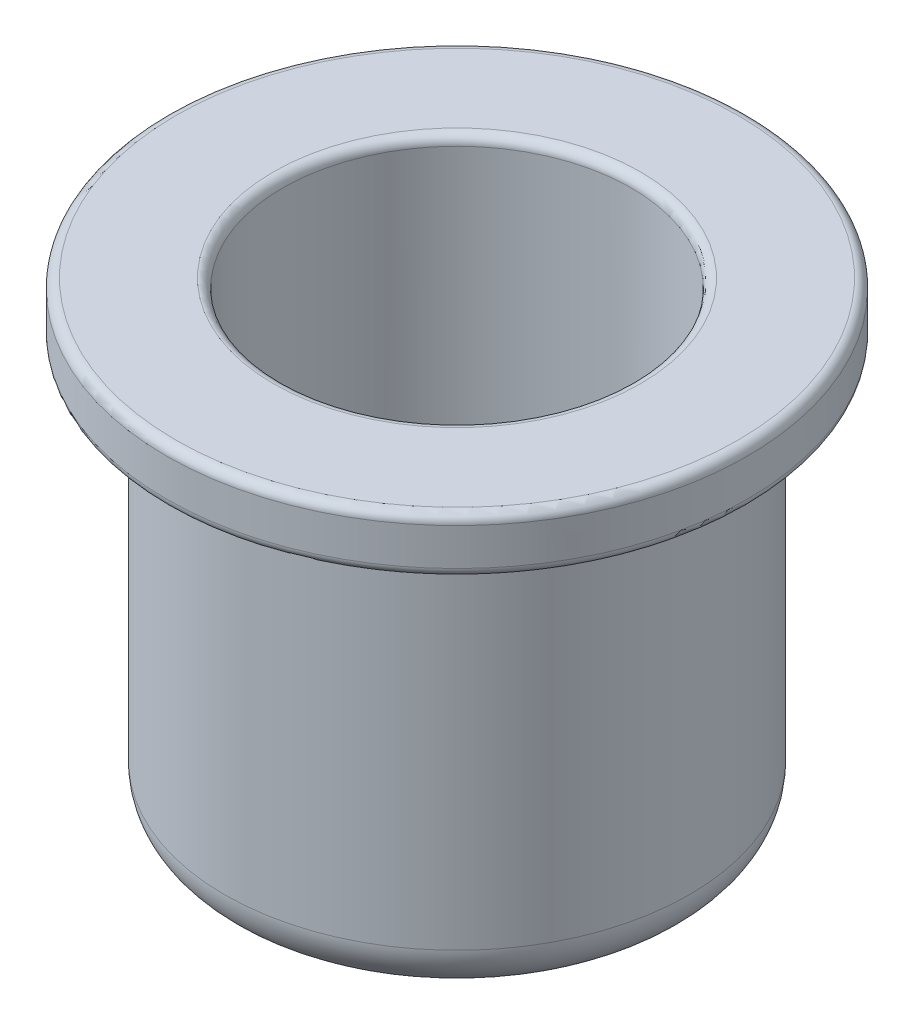
ISO-10303-21;
HEADER;
FILE_DESCRIPTION(('STEP AP214'),'2;1');
FILE_NAME('part.step','',(''),(''),'','','');
FILE_SCHEMA(('AUTOMOTIVE_DESIGN { 1 0 10303 214 1 1 1 1 }'));
ENDSEC;
DATA;
#1=APPLICATION_CONTEXT('core data for automotive mechanical design processes');
#2=APPLICATION_PROTOCOL_DEFINITION('international standard','automotive_design',2000,#1);
#3=PRODUCT_CONTEXT('',#1,'mechanical');
#4=PRODUCT('Part','Part','',(#3));
#5=PRODUCT_RELATED_PRODUCT_CATEGORY('part','',(#4));
#6=PRODUCT_DEFINITION_FORMATION('','',#4);
#7=PRODUCT_DEFINITION_CONTEXT('part definition',#1,'design');
#8=PRODUCT_DEFINITION('design','',#6,#7);
#9=PRODUCT_DEFINITION_SHAPE('','',#8);
#10=(LENGTH_UNIT() NAMED_UNIT(*) SI_UNIT(.MILLI.,.METRE.));
#11=(NAMED_UNIT(*) PLANE_ANGLE_UNIT() SI_UNIT($,.RADIAN.));
#12=(NAMED_UNIT(*) SI_UNIT($,.STERADIAN.) SOLID_ANGLE_UNIT());
#13=UNCERTAINTY_MEASURE_WITH_UNIT(LENGTH_MEASURE(1.E-05),#10,'distance_accuracy_value','');
#14=(GEOMETRIC_REPRESENTATION_CONTEXT(3) GLOBAL_UNCERTAINTY_ASSIGNED_CONTEXT((#13)) GLOBAL_UNIT_ASSIGNED_CONTEXT((#10,
#11,#12)) REPRESENTATION_CONTEXT('',''));
#15=CARTESIAN_POINT('',(0.,0.,0.));
#16=DIRECTION('',(0.,0.,1.));
#17=DIRECTION('',(1.,0.,0.));
#18=AXIS2_PLACEMENT_3D('',#15,#16,#17);
#19=CARTESIAN_POINT('',(0.,12.7,0.));
#20=DIRECTION('',(0.,1.,0.));
#21=DIRECTION('',(0.,0.,1.));
#22=AXIS2_PLACEMENT_3D('',#19,#20,#21);
#23=PLANE('',#22);
#24=CARTESIAN_POINT('',(0.,12.7,0.));
#25=DIRECTION('',(0.,1.,0.));
#26=DIRECTION('',(-1.,0.,5.66735536331981E-13));
#27=AXIS2_PLACEMENT_3D('',#24,#25,#26);
#28=CIRCLE('',#27,5.0165);
#29=CARTESIAN_POINT('',(-5.0165,12.7,1.14105258488892E-12));
#30=VERTEX_POINT('',#29);
#31=CARTESIAN_POINT('',(5.0165,12.7,-5.77948063548833E-13));
#32=VERTEX_POINT('',#31);
#33=EDGE_CURVE('E67',#30,#32,#28,.T.);
#34=ORIENTED_EDGE('',*,*,#33,.F.);
#35=CARTESIAN_POINT('',(0.,12.7,0.));
#36=DIRECTION('',(0.,1.,0.));
#37=DIRECTION('',(1.,0.,0.));
#38=AXIS2_PLACEMENT_3D('',#35,#36,#37);
#39=CIRCLE('',#38,5.0165);
#40=EDGE_CURVE('E62',#32,#30,#39,.T.);
#41=ORIENTED_EDGE('',*,*,#40,.F.);
#42=EDGE_LOOP('',(#34,#41));
#43=FACE_BOUND('',#42,.T.);
#44=CARTESIAN_POINT('',(0.,12.7,0.));
#45=DIRECTION('',(0.,-1.,0.));
#46=DIRECTION('',(1.,0.,0.));
#47=AXIS2_PLACEMENT_3D('',#44,#45,#46);
#48=CIRCLE('',#47,7.6835);
#49=CARTESIAN_POINT('',(7.6835,12.7,0.));
#50=VERTEX_POINT('',#49);
#51=CARTESIAN_POINT('',(-7.6835,12.7,0.));
#52=VERTEX_POINT('',#51);
#53=EDGE_CURVE('E105',#50,#52,#48,.T.);
#54=ORIENTED_EDGE('',*,*,#53,.F.);
#55=CARTESIAN_POINT('',(0.,12.7,0.));
#56=DIRECTION('',(0.,-1.,0.));
#57=DIRECTION('',(-1.,0.,0.));
#58=AXIS2_PLACEMENT_3D('',#55,#56,#57);
#59=CIRCLE('',#58,7.6835);
#60=EDGE_CURVE('E73',#52,#50,#59,.T.);
#61=ORIENTED_EDGE('',*,*,#60,.F.);
#62=EDGE_LOOP('',(#54,#61));
#63=FACE_BOUND('',#62,.T.);
#64=ADVANCED_FACE('F16',(#43,#63),#23,.T.);
#65=CARTESIAN_POINT('',(0.,12.446,0.));
#66=DIRECTION('',(0.,1.,0.));
#67=DIRECTION('',(0.999930025461511,0.,-0.0118298005283784));
#68=AXIS2_PLACEMENT_3D('',#65,#66,#67);
#69=TOROIDAL_SURFACE('',#68,5.0165,0.254);
#70=CARTESIAN_POINT('',(0.,12.446,0.));
#71=DIRECTION('',(0.,1.,0.));
#72=DIRECTION('',(0.,0.,1.));
#73=AXIS2_PLACEMENT_3D('',#70,#71,#72);
#74=CIRCLE('',#73,4.7625);
#75=CARTESIAN_POINT('',(0.,12.446,4.7625));
#76=VERTEX_POINT('',#75);
#77=EDGE_CURVE('E101',#76,#76,#74,.F.);
#78=ORIENTED_EDGE('',*,*,#77,.T.);
#79=EDGE_LOOP('',(#78));
#80=FACE_BOUND('',#79,.T.);
#81=ORIENTED_EDGE('',*,*,#33,.T.);
#82=ORIENTED_EDGE('',*,*,#40,.T.);
#83=EDGE_LOOP('',(#81,#82));
#84=FACE_BOUND('',#83,.T.);
#85=ADVANCED_FACE('F72',(#80,#84),#69,.T.);
#86=CARTESIAN_POINT('',(0.,12.446,0.));
#87=DIRECTION('',(0.,1.,0.));
#88=DIRECTION('',(-0.999987516677049,0.,-0.00499664788318093));
#89=AXIS2_PLACEMENT_3D('',#86,#87,#88);
#90=TOROIDAL_SURFACE('',#89,7.6835,0.254);
#91=CARTESIAN_POINT('',(0.,12.446,0.));
#92=DIRECTION('',(0.,1.,0.));
#93=DIRECTION('',(0.,0.,1.));
#94=AXIS2_PLACEMENT_3D('',#91,#92,#93);
#95=CIRCLE('',#94,7.9375);
#96=CARTESIAN_POINT('',(0.,12.446,7.9375));
#97=VERTEX_POINT('',#96);
#98=EDGE_CURVE('E139',#97,#97,#95,.F.);
#99=ORIENTED_EDGE('',*,*,#98,.F.);
#100=EDGE_LOOP('',(#99));
#101=FACE_BOUND('',#100,.T.);
#102=ORIENTED_EDGE('',*,*,#53,.T.);
#103=ORIENTED_EDGE('',*,*,#60,.T.);
#104=EDGE_LOOP('',(#102,#103));
#105=FACE_BOUND('',#104,.T.);
#106=ADVANCED_FACE('F92',(#101,#105),#90,.T.);
#107=CARTESIAN_POINT('',(0.,0.,0.));
#108=DIRECTION('',(0.,1.,0.));
#109=DIRECTION('',(0.,0.,1.));
#110=AXIS2_PLACEMENT_3D('',#107,#108,#109);
#111=CYLINDRICAL_SURFACE('',#110,4.7625);
#112=CARTESIAN_POINT('',(0.,0.254,0.));
#113=DIRECTION('',(0.,1.,0.));
#114=DIRECTION('',(-0.999965324231172,0.,-0.00832768486716382));
#115=AXIS2_PLACEMENT_3D('',#112,#113,#114);
#116=CIRCLE('',#115,4.7625);
#117=CARTESIAN_POINT('',(-4.76233485665096,0.254,-0.0396605991798677));
#118=VERTEX_POINT('',#117);
#119=EDGE_CURVE('E142',#118,#118,#116,.T.);
#120=ORIENTED_EDGE('',*,*,#119,.F.);
#121=EDGE_LOOP('',(#120));
#122=FACE_BOUND('',#121,.T.);
#123=ORIENTED_EDGE('',*,*,#77,.F.);
#124=EDGE_LOOP('',(#123));
#125=FACE_BOUND('',#124,.T.);
#126=ADVANCED_FACE('F309',(#122,#125),#111,.F.);
#127=CARTESIAN_POINT('',(0.,12.7,0.));
#128=DIRECTION('',(0.,1.,0.));
#129=DIRECTION('',(0.,0.,1.));
#130=AXIS2_PLACEMENT_3D('',#127,#128,#129);
#131=CYLINDRICAL_SURFACE('',#130,7.9375);
#132=ORIENTED_EDGE('',*,*,#98,.T.);
#133=EDGE_LOOP('',(#132));
#134=FACE_BOUND('',#133,.T.);
#135=CARTESIAN_POINT('',(0.,11.43,0.));
#136=DIRECTION('',(0.,1.,0.));
#137=DIRECTION('',(0.999974808978118,0.,-0.0070979862761847));
#138=AXIS2_PLACEMENT_3D('',#135,#136,#137);
#139=CIRCLE('',#138,7.9375);
#140=CARTESIAN_POINT('',(7.93730004626381,11.43,-0.0563402660672161));
#141=VERTEX_POINT('',#140);
#142=EDGE_CURVE('E146',#141,#141,#139,.F.);
#143=ORIENTED_EDGE('',*,*,#142,.F.);
#144=EDGE_LOOP('',(#143));
#145=FACE_BOUND('',#144,.T.);
#146=ADVANCED_FACE('F271',(#134,#145),#131,.T.);
#147=CARTESIAN_POINT('',(0.,0.254,0.));
#148=DIRECTION('',(0.,1.,0.));
#149=DIRECTION('',(-0.999965324231172,0.,-0.00832768486716382));
#150=AXIS2_PLACEMENT_3D('',#147,#148,#149);
#151=TOROIDAL_SURFACE('',#150,5.0165,0.254);
#152=ORIENTED_EDGE('',*,*,#119,.T.);
#153=EDGE_LOOP('',(#152));
#154=FACE_BOUND('',#153,.T.);
#155=CARTESIAN_POINT('',(0.,0.,0.));
#156=DIRECTION('',(0.,-1.,0.));
#157=DIRECTION('',(1.,0.,0.));
#158=AXIS2_PLACEMENT_3D('',#155,#156,#157);
#159=CIRCLE('',#158,5.01649999999999);
#160=CARTESIAN_POINT('',(5.01649999999999,0.,1.7815155374234E-13));
#161=VERTEX_POINT('',#160);
#162=CARTESIAN_POINT('',(-5.01649999999999,0.,0.));
#163=VERTEX_POINT('',#162);
#164=EDGE_CURVE('E235',#161,#163,#159,.T.);
#165=ORIENTED_EDGE('',*,*,#164,.T.);
#166=CARTESIAN_POINT('',(0.,0.,0.));
#167=DIRECTION('',(0.,-1.,0.));
#168=DIRECTION('',(-1.,0.,0.));
#169=AXIS2_PLACEMENT_3D('',#166,#167,#168);
#170=CIRCLE('',#169,5.0165);
#171=EDGE_CURVE('E295',#163,#161,#170,.T.);
#172=ORIENTED_EDGE('',*,*,#171,.T.);
#173=EDGE_LOOP('',(#165,#172));
#174=FACE_BOUND('',#173,.T.);
#175=ADVANCED_FACE('F267',(#154,#174),#151,.T.);
#176=CARTESIAN_POINT('',(0.,11.43,0.));
#177=DIRECTION('',(0.,1.,0.));
#178=DIRECTION('',(0.999974808978118,0.,-0.0070979862761847));
#179=AXIS2_PLACEMENT_3D('',#176,#177,#178);
#180=TOROIDAL_SURFACE('',#179,7.6835,0.254);
#181=ORIENTED_EDGE('',*,*,#142,.T.);
#182=EDGE_LOOP('',(#181));
#183=FACE_BOUND('',#182,.T.);
#184=CARTESIAN_POINT('',(0.,11.176,0.));
#185=DIRECTION('',(0.,1.,0.));
#186=DIRECTION('',(-1.,0.,2.02580604238334E-13));
#187=AXIS2_PLACEMENT_3D('',#184,#185,#186);
#188=CIRCLE('',#187,7.6835);
#189=CARTESIAN_POINT('',(-7.6835,11.176,6.22345976841524E-13));
#190=VERTEX_POINT('',#189);
#191=CARTESIAN_POINT('',(7.6835,11.176,-3.09297130008518E-13));
#192=VERTEX_POINT('',#191);
#193=EDGE_CURVE('E188',#190,#192,#188,.T.);
#194=ORIENTED_EDGE('',*,*,#193,.T.);
#195=CARTESIAN_POINT('',(0.,11.176,0.));
#196=DIRECTION('',(0.,1.,0.));
#197=DIRECTION('',(1.,0.,0.));
#198=AXIS2_PLACEMENT_3D('',#195,#196,#197);
#199=CIRCLE('',#198,7.6835);
#200=EDGE_CURVE('E178',#192,#190,#199,.T.);
#201=ORIENTED_EDGE('',*,*,#200,.T.);
#202=EDGE_LOOP('',(#194,#201));
#203=FACE_BOUND('',#202,.T.);
#204=ADVANCED_FACE('F212',(#183,#203),#180,.T.);
#205=CARTESIAN_POINT('',(0.,0.,0.));
#206=DIRECTION('',(0.,1.,0.));
#207=DIRECTION('',(0.,0.,1.));
#208=AXIS2_PLACEMENT_3D('',#205,#206,#207);
#209=PLANE('',#208);
#210=ORIENTED_EDGE('',*,*,#171,.F.);
#211=ORIENTED_EDGE('',*,*,#164,.F.);
#212=EDGE_LOOP('',(#210,#211));
#213=FACE_BOUND('',#212,.T.);
#214=CARTESIAN_POINT('',(0.,0.,0.));
#215=DIRECTION('',(0.,1.,0.));
#216=DIRECTION('',(-1.,0.,0.));
#217=AXIS2_PLACEMENT_3D('',#214,#215,#216);
#218=CIRCLE('',#217,5.08);
#219=CARTESIAN_POINT('',(-5.08,0.,8.21163046436166E-13));
#220=VERTEX_POINT('',#219);
#221=CARTESIAN_POINT('',(5.08,0.,-1.64493816566697E-12));
#222=VERTEX_POINT('',#221);
#223=EDGE_CURVE('E35',#220,#222,#218,.T.);
#224=ORIENTED_EDGE('',*,*,#223,.F.);
#225=CARTESIAN_POINT('',(0.,0.,0.));
#226=DIRECTION('',(0.,1.,0.));
#227=DIRECTION('',(1.,0.,-8.09774168856337E-13));
#228=AXIS2_PLACEMENT_3D('',#225,#226,#227);
#229=CIRCLE('',#228,5.08);
#230=EDGE_CURVE('E244',#222,#220,#229,.T.);
#231=ORIENTED_EDGE('',*,*,#230,.F.);
#232=EDGE_LOOP('',(#224,#231));
#233=FACE_BOUND('',#232,.T.);
#234=ADVANCED_FACE('F203',(#213,#233),#209,.F.);
#235=CARTESIAN_POINT('',(0.,11.176,0.));
#236=DIRECTION('',(0.,1.,0.));
#237=DIRECTION('',(0.,0.,1.));
#238=AXIS2_PLACEMENT_3D('',#235,#236,#237);
#239=PLANE('',#238);
#240=CARTESIAN_POINT('',(0.,11.176,0.));
#241=DIRECTION('',(0.,1.,0.));
#242=DIRECTION('',(0.,0.,1.));
#243=AXIS2_PLACEMENT_3D('',#240,#241,#242);
#244=CIRCLE('',#243,6.35);
#245=CARTESIAN_POINT('',(0.,11.176,6.35));
#246=VERTEX_POINT('',#245);
#247=EDGE_CURVE('E27',#246,#246,#244,.F.);
#248=ORIENTED_EDGE('',*,*,#247,.F.);
#249=EDGE_LOOP('',(#248));
#250=FACE_BOUND('',#249,.T.);
#251=ORIENTED_EDGE('',*,*,#200,.F.);
#252=ORIENTED_EDGE('',*,*,#193,.F.);
#253=EDGE_LOOP('',(#251,#252));
#254=FACE_BOUND('',#253,.T.);
#255=ADVANCED_FACE('F166',(#250,#254),#239,.F.);
#256=CARTESIAN_POINT('',(0.,1.27,0.));
#257=DIRECTION('',(0.,1.,0.));
#258=DIRECTION('',(-0.999960639121267,0.,0.00887244093742775));
#259=AXIS2_PLACEMENT_3D('',#256,#257,#258);
#260=TOROIDAL_SURFACE('',#259,5.08,1.27);
#261=CARTESIAN_POINT('',(0.,1.27,0.));
#262=DIRECTION('',(0.,1.,0.));
#263=DIRECTION('',(0.,0.,1.));
#264=AXIS2_PLACEMENT_3D('',#261,#262,#263);
#265=CIRCLE('',#264,6.35);
#266=CARTESIAN_POINT('',(0.,1.27,6.35));
#267=VERTEX_POINT('',#266);
#268=EDGE_CURVE('E11',#267,#267,#265,.T.);
#269=ORIENTED_EDGE('',*,*,#268,.F.);
#270=EDGE_LOOP('',(#269));
#271=FACE_BOUND('',#270,.T.);
#272=ORIENTED_EDGE('',*,*,#230,.T.);
#273=ORIENTED_EDGE('',*,*,#223,.T.);
#274=EDGE_LOOP('',(#272,#273));
#275=FACE_BOUND('',#274,.T.);
#276=ADVANCED_FACE('F154',(#271,#275),#260,.T.);
#277=CARTESIAN_POINT('',(0.,0.,0.));
#278=DIRECTION('',(0.,1.,0.));
#279=DIRECTION('',(0.,0.,1.));
#280=AXIS2_PLACEMENT_3D('',#277,#278,#279);
#281=CYLINDRICAL_SURFACE('',#280,6.35);
#282=ORIENTED_EDGE('',*,*,#247,.T.);
#283=EDGE_LOOP('',(#282));
#284=FACE_BOUND('',#283,.T.);
#285=ORIENTED_EDGE('',*,*,#268,.T.);
#286=EDGE_LOOP('',(#285));
#287=FACE_BOUND('',#286,.T.);
#288=ADVANCED_FACE('F165',(#284,#287),#281,.T.);
#289=CLOSED_SHELL('',(#64,#85,#106,#126,#146,#175,#204,#234,#255,#276,#288));
#290=MANIFOLD_SOLID_BREP('B1',#289);
#291=ADVANCED_BREP_SHAPE_REPRESENTATION('',(#18,#290),#14);
#292=SHAPE_DEFINITION_REPRESENTATION(#9,#291);
ENDSEC;
END-ISO-10303-21;
